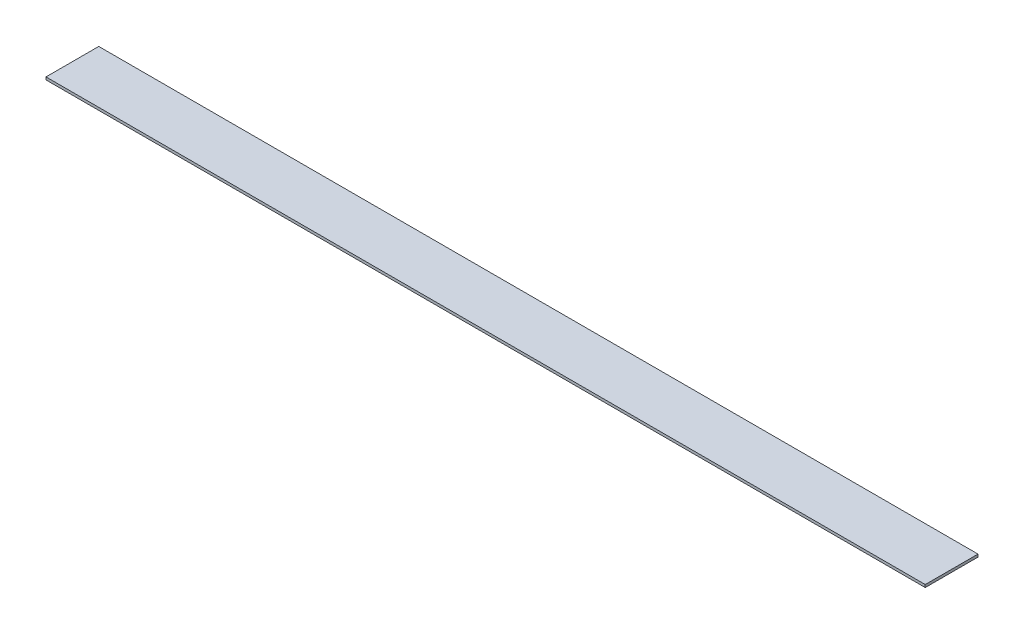
ISO-10303-21;
HEADER;
FILE_DESCRIPTION(('STEP AP214'),'2;1');
FILE_NAME('part.step','',(''),(''),'','','');
FILE_SCHEMA(('AUTOMOTIVE_DESIGN { 1 0 10303 214 1 1 1 1 }'));
ENDSEC;
DATA;
#1=APPLICATION_CONTEXT('core data for automotive mechanical design processes');
#2=APPLICATION_PROTOCOL_DEFINITION('international standard','automotive_design',2000,#1);
#3=PRODUCT_CONTEXT('',#1,'mechanical');
#4=PRODUCT('Part','Part','',(#3));
#5=PRODUCT_RELATED_PRODUCT_CATEGORY('part','',(#4));
#6=PRODUCT_DEFINITION_FORMATION('','',#4);
#7=PRODUCT_DEFINITION_CONTEXT('part definition',#1,'design');
#8=PRODUCT_DEFINITION('design','',#6,#7);
#9=PRODUCT_DEFINITION_SHAPE('','',#8);
#10=(LENGTH_UNIT() NAMED_UNIT(*) SI_UNIT(.MILLI.,.METRE.));
#11=(NAMED_UNIT(*) PLANE_ANGLE_UNIT() SI_UNIT($,.RADIAN.));
#12=(NAMED_UNIT(*) SI_UNIT($,.STERADIAN.) SOLID_ANGLE_UNIT());
#13=UNCERTAINTY_MEASURE_WITH_UNIT(LENGTH_MEASURE(1.E-05),#10,'distance_accuracy_value','');
#14=(GEOMETRIC_REPRESENTATION_CONTEXT(3) GLOBAL_UNCERTAINTY_ASSIGNED_CONTEXT((#13)) GLOBAL_UNIT_ASSIGNED_CONTEXT((#10,
#11,#12)) REPRESENTATION_CONTEXT('',''));
#15=CARTESIAN_POINT('',(0.,0.,0.));
#16=DIRECTION('',(0.,0.,1.));
#17=DIRECTION('',(1.,0.,0.));
#18=AXIS2_PLACEMENT_3D('',#15,#16,#17);
#19=CARTESIAN_POINT('',(250.,-1.5,15.));
#20=DIRECTION('',(1.,0.,0.));
#21=DIRECTION('',(0.,0.,-1.));
#22=AXIS2_PLACEMENT_3D('',#19,#20,#21);
#23=PLANE('',#22);
#24=DIRECTION('',(0.,0.,-1.));
#25=VECTOR('',#24,1.);
#26=CARTESIAN_POINT('',(250.,0.,15.));
#27=LINE('',#26,#25);
#28=CARTESIAN_POINT('',(250.,0.,15.));
#29=VERTEX_POINT('',#28);
#30=CARTESIAN_POINT('',(250.,0.,-15.));
#31=VERTEX_POINT('',#30);
#32=EDGE_CURVE('E81',#29,#31,#27,.T.);
#33=ORIENTED_EDGE('',*,*,#32,.F.);
#34=DIRECTION('',(0.,1.,0.));
#35=VECTOR('',#34,1.);
#36=CARTESIAN_POINT('',(250.,-1.5,15.));
#37=LINE('',#36,#35);
#38=CARTESIAN_POINT('',(250.,-1.5,15.));
#39=VERTEX_POINT('',#38);
#40=EDGE_CURVE('E11',#39,#29,#37,.T.);
#41=ORIENTED_EDGE('',*,*,#40,.F.);
#42=DIRECTION('',(0.,0.,-1.));
#43=VECTOR('',#42,1.);
#44=CARTESIAN_POINT('',(250.,-1.5,15.));
#45=LINE('',#44,#43);
#46=CARTESIAN_POINT('',(250.,-1.5,-15.));
#47=VERTEX_POINT('',#46);
#48=EDGE_CURVE('E75',#39,#47,#45,.T.);
#49=ORIENTED_EDGE('',*,*,#48,.T.);
#50=DIRECTION('',(0.,1.,0.));
#51=VECTOR('',#50,1.);
#52=CARTESIAN_POINT('',(250.,-1.5,-15.));
#53=LINE('',#52,#51);
#54=EDGE_CURVE('E20',#47,#31,#53,.T.);
#55=ORIENTED_EDGE('',*,*,#54,.T.);
#56=EDGE_LOOP('',(#33,#41,#49,#55));
#57=FACE_BOUND('',#56,.T.);
#58=ADVANCED_FACE('F17',(#57),#23,.T.);
#59=CARTESIAN_POINT('',(-250.,-1.5,15.));
#60=DIRECTION('',(0.,0.,1.));
#61=DIRECTION('',(1.,0.,0.));
#62=AXIS2_PLACEMENT_3D('',#59,#60,#61);
#63=PLANE('',#62);
#64=DIRECTION('',(1.,0.,0.));
#65=VECTOR('',#64,1.);
#66=CARTESIAN_POINT('',(-250.,0.,15.));
#67=LINE('',#66,#65);
#68=CARTESIAN_POINT('',(-250.,0.,15.));
#69=VERTEX_POINT('',#68);
#70=EDGE_CURVE('E77',#69,#29,#67,.T.);
#71=ORIENTED_EDGE('',*,*,#70,.F.);
#72=DIRECTION('',(0.,1.,0.));
#73=VECTOR('',#72,1.);
#74=CARTESIAN_POINT('',(-250.,-1.5,15.));
#75=LINE('',#74,#73);
#76=CARTESIAN_POINT('',(-250.,-1.5,15.));
#77=VERTEX_POINT('',#76);
#78=EDGE_CURVE('E26',#77,#69,#75,.T.);
#79=ORIENTED_EDGE('',*,*,#78,.F.);
#80=DIRECTION('',(1.,0.,0.));
#81=VECTOR('',#80,1.);
#82=CARTESIAN_POINT('',(-250.,-1.5,15.));
#83=LINE('',#82,#81);
#84=EDGE_CURVE('E72',#77,#39,#83,.T.);
#85=ORIENTED_EDGE('',*,*,#84,.T.);
#86=ORIENTED_EDGE('',*,*,#40,.T.);
#87=EDGE_LOOP('',(#71,#79,#85,#86));
#88=FACE_BOUND('',#87,.T.);
#89=ADVANCED_FACE('F91',(#88),#63,.T.);
#90=CARTESIAN_POINT('',(-250.,-1.5,15.));
#91=DIRECTION('',(-1.,0.,0.));
#92=DIRECTION('',(0.,0.,1.));
#93=AXIS2_PLACEMENT_3D('',#90,#91,#92);
#94=PLANE('',#93);
#95=DIRECTION('',(0.,0.,1.));
#96=VECTOR('',#95,1.);
#97=CARTESIAN_POINT('',(-250.,0.,15.));
#98=LINE('',#97,#96);
#99=CARTESIAN_POINT('',(-250.,0.,-15.));
#100=VERTEX_POINT('',#99);
#101=EDGE_CURVE('E67',#100,#69,#98,.T.);
#102=ORIENTED_EDGE('',*,*,#101,.F.);
#103=DIRECTION('',(0.,1.,0.));
#104=VECTOR('',#103,1.);
#105=CARTESIAN_POINT('',(-250.,-1.5,-15.));
#106=LINE('',#105,#104);
#107=CARTESIAN_POINT('',(-250.,-1.5,-15.));
#108=VERTEX_POINT('',#107);
#109=EDGE_CURVE('E62',#108,#100,#106,.T.);
#110=ORIENTED_EDGE('',*,*,#109,.F.);
#111=DIRECTION('',(0.,0.,1.));
#112=VECTOR('',#111,1.);
#113=CARTESIAN_POINT('',(-250.,-1.5,15.));
#114=LINE('',#113,#112);
#115=EDGE_CURVE('E65',#108,#77,#114,.T.);
#116=ORIENTED_EDGE('',*,*,#115,.T.);
#117=ORIENTED_EDGE('',*,*,#78,.T.);
#118=EDGE_LOOP('',(#102,#110,#116,#117));
#119=FACE_BOUND('',#118,.T.);
#120=ADVANCED_FACE('F64',(#119),#94,.T.);
#121=CARTESIAN_POINT('',(-250.,-1.5,-15.));
#122=DIRECTION('',(0.,0.,-1.));
#123=DIRECTION('',(-1.,0.,0.));
#124=AXIS2_PLACEMENT_3D('',#121,#122,#123);
#125=PLANE('',#124);
#126=DIRECTION('',(-1.,0.,0.));
#127=VECTOR('',#126,1.);
#128=CARTESIAN_POINT('',(-250.,0.,-15.));
#129=LINE('',#128,#127);
#130=EDGE_CURVE('E84',#31,#100,#129,.T.);
#131=ORIENTED_EDGE('',*,*,#130,.F.);
#132=ORIENTED_EDGE('',*,*,#54,.F.);
#133=DIRECTION('',(-1.,0.,0.));
#134=VECTOR('',#133,1.);
#135=CARTESIAN_POINT('',(-250.,-1.5,-15.));
#136=LINE('',#135,#134);
#137=EDGE_CURVE('E71',#47,#108,#136,.T.);
#138=ORIENTED_EDGE('',*,*,#137,.T.);
#139=ORIENTED_EDGE('',*,*,#109,.T.);
#140=EDGE_LOOP('',(#131,#132,#138,#139));
#141=FACE_BOUND('',#140,.T.);
#142=ADVANCED_FACE('F74',(#141),#125,.T.);
#143=CARTESIAN_POINT('',(0.,-1.5,0.));
#144=DIRECTION('',(0.,-1.,0.));
#145=DIRECTION('',(0.,0.,-1.));
#146=AXIS2_PLACEMENT_3D('',#143,#144,#145);
#147=PLANE('',#146);
#148=ORIENTED_EDGE('',*,*,#48,.F.);
#149=ORIENTED_EDGE('',*,*,#84,.F.);
#150=ORIENTED_EDGE('',*,*,#115,.F.);
#151=ORIENTED_EDGE('',*,*,#137,.F.);
#152=EDGE_LOOP('',(#148,#149,#150,#151));
#153=FACE_BOUND('',#152,.T.);
#154=ADVANCED_FACE('F70',(#153),#147,.T.);
#155=CARTESIAN_POINT('',(0.,0.,0.));
#156=DIRECTION('',(0.,-1.,0.));
#157=DIRECTION('',(0.,0.,-1.));
#158=AXIS2_PLACEMENT_3D('',#155,#156,#157);
#159=PLANE('',#158);
#160=ORIENTED_EDGE('',*,*,#32,.T.);
#161=ORIENTED_EDGE('',*,*,#130,.T.);
#162=ORIENTED_EDGE('',*,*,#101,.T.);
#163=ORIENTED_EDGE('',*,*,#70,.T.);
#164=EDGE_LOOP('',(#160,#161,#162,#163));
#165=FACE_BOUND('',#164,.T.);
#166=ADVANCED_FACE('F90',(#165),#159,.F.);
#167=CLOSED_SHELL('',(#58,#89,#120,#142,#154,#166));
#168=MANIFOLD_SOLID_BREP('B1',#167);
#169=ADVANCED_BREP_SHAPE_REPRESENTATION('',(#18,#168),#14);
#170=SHAPE_DEFINITION_REPRESENTATION(#9,#169);
ENDSEC;
END-ISO-10303-21;
